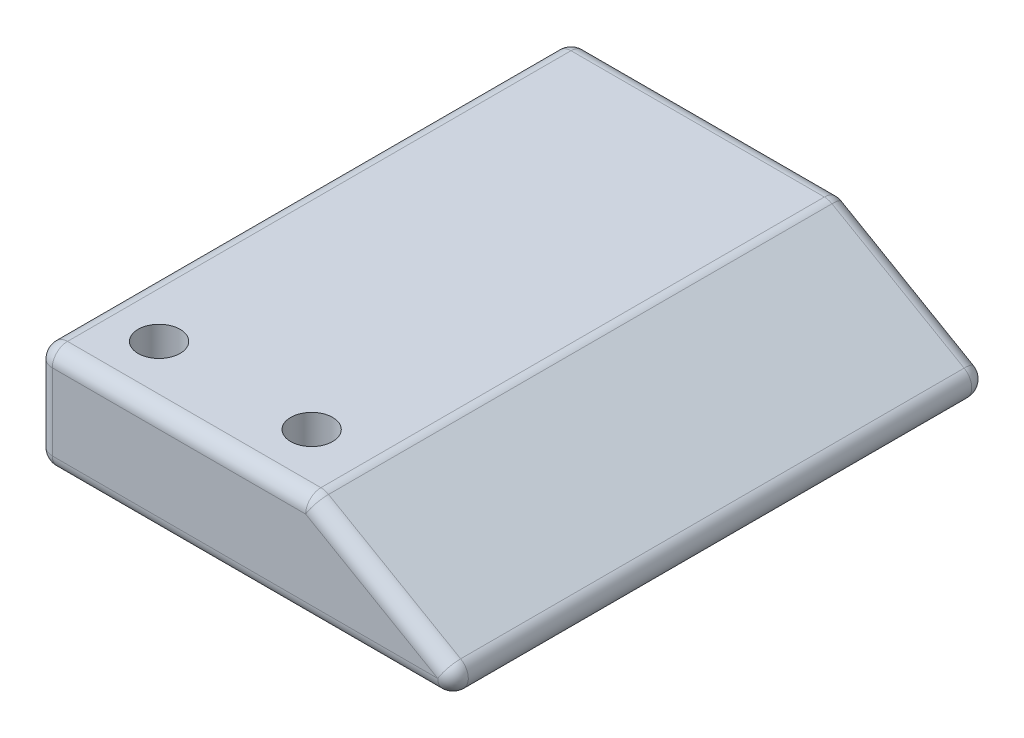
ISO-10303-21;
HEADER;
FILE_DESCRIPTION(('STEP AP214'),'2;1');
FILE_NAME('part.step','',(''),(''),'','','');
FILE_SCHEMA(('AUTOMOTIVE_DESIGN { 1 0 10303 214 1 1 1 1 }'));
ENDSEC;
DATA;
#1=APPLICATION_CONTEXT('core data for automotive mechanical design processes');
#2=APPLICATION_PROTOCOL_DEFINITION('international standard','automotive_design',2000,#1);
#3=PRODUCT_CONTEXT('',#1,'mechanical');
#4=PRODUCT('Part','Part','',(#3));
#5=PRODUCT_RELATED_PRODUCT_CATEGORY('part','',(#4));
#6=PRODUCT_DEFINITION_FORMATION('','',#4);
#7=PRODUCT_DEFINITION_CONTEXT('part definition',#1,'design');
#8=PRODUCT_DEFINITION('design','',#6,#7);
#9=PRODUCT_DEFINITION_SHAPE('','',#8);
#10=(LENGTH_UNIT() NAMED_UNIT(*) SI_UNIT(.MILLI.,.METRE.));
#11=(NAMED_UNIT(*) PLANE_ANGLE_UNIT() SI_UNIT($,.RADIAN.));
#12=(NAMED_UNIT(*) SI_UNIT($,.STERADIAN.) SOLID_ANGLE_UNIT());
#13=UNCERTAINTY_MEASURE_WITH_UNIT(LENGTH_MEASURE(1.E-05),#10,'distance_accuracy_value','');
#14=(GEOMETRIC_REPRESENTATION_CONTEXT(3) GLOBAL_UNCERTAINTY_ASSIGNED_CONTEXT((#13)) GLOBAL_UNIT_ASSIGNED_CONTEXT((#10,
#11,#12)) REPRESENTATION_CONTEXT('',''));
#15=CARTESIAN_POINT('',(0.,0.,0.));
#16=DIRECTION('',(0.,0.,1.));
#17=DIRECTION('',(1.,0.,0.));
#18=AXIS2_PLACEMENT_3D('',#15,#16,#17);
#19=CARTESIAN_POINT('',(60.,0.,-70.));
#20=DIRECTION('',(0.,1.,0.));
#21=DIRECTION('',(0.,0.,-1.));
#22=AXIS2_PLACEMENT_3D('',#19,#20,#21);
#23=PLANE('',#22);
#24=DIRECTION('',(1.,0.,0.));
#25=VECTOR('',#24,1.);
#26=CARTESIAN_POINT('',(60.,0.,-2.));
#27=LINE('',#26,#25);
#28=CARTESIAN_POINT('',(2.,0.,-2.));
#29=VERTEX_POINT('',#28);
#30=CARTESIAN_POINT('',(52.5358983848623,0.,-2.));
#31=VERTEX_POINT('',#30);
#32=EDGE_CURVE('E181',#29,#31,#27,.T.);
#33=ORIENTED_EDGE('',*,*,#32,.F.);
#34=DIRECTION('',(0.,0.,1.));
#35=VECTOR('',#34,1.);
#36=CARTESIAN_POINT('',(2.,0.,-70.));
#37=LINE('',#36,#35);
#38=CARTESIAN_POINT('',(2.,0.,-68.));
#39=VERTEX_POINT('',#38);
#40=EDGE_CURVE('E175',#39,#29,#37,.T.);
#41=ORIENTED_EDGE('',*,*,#40,.F.);
#42=DIRECTION('',(1.,0.,0.));
#43=VECTOR('',#42,1.);
#44=CARTESIAN_POINT('',(60.,0.,-68.));
#45=LINE('',#44,#43);
#46=CARTESIAN_POINT('',(52.5358983848623,0.,-68.));
#47=VERTEX_POINT('',#46);
#48=EDGE_CURVE('E178',#47,#39,#45,.F.);
#49=ORIENTED_EDGE('',*,*,#48,.F.);
#50=DIRECTION('',(0.,0.,1.));
#51=VECTOR('',#50,1.);
#52=CARTESIAN_POINT('',(52.5358983848623,0.,-70.));
#53=LINE('',#52,#51);
#54=EDGE_CURVE('E184',#31,#47,#53,.F.);
#55=ORIENTED_EDGE('',*,*,#54,.F.);
#56=EDGE_LOOP('',(#33,#41,#49,#55));
#57=FACE_BOUND('',#56,.T.);
#58=CARTESIAN_POINT('',(8.,0.,-8.));
#59=DIRECTION('',(0.,1.,0.));
#60=DIRECTION('',(0.,0.,1.));
#61=AXIS2_PLACEMENT_3D('',#58,#59,#60);
#62=CIRCLE('',#61,5.6);
#63=CARTESIAN_POINT('',(8.,0.,-2.4));
#64=VERTEX_POINT('',#63);
#65=EDGE_CURVE('E269',#64,#64,#62,.T.);
#66=ORIENTED_EDGE('',*,*,#65,.T.);
#67=EDGE_LOOP('',(#66));
#68=FACE_BOUND('',#67,.T.);
#69=CARTESIAN_POINT('',(28.,0.,-8.));
#70=DIRECTION('',(0.,1.,0.));
#71=DIRECTION('',(0.,0.,1.));
#72=AXIS2_PLACEMENT_3D('',#69,#70,#71);
#73=CIRCLE('',#72,5.6);
#74=CARTESIAN_POINT('',(28.,0.,-2.4));
#75=VERTEX_POINT('',#74);
#76=EDGE_CURVE('E282',#75,#75,#73,.T.);
#77=ORIENTED_EDGE('',*,*,#76,.T.);
#78=EDGE_LOOP('',(#77));
#79=FACE_BOUND('',#78,.T.);
#80=ADVANCED_FACE('F37',(#57,#68,#79),#23,.F.);
#81=CARTESIAN_POINT('',(35.7512886940358,14.,-70.));
#82=DIRECTION('',(-0.500000000000001,-0.866025403784438,0.));
#83=DIRECTION('',(0.866025403784438,-0.500000000000001,0.));
#84=AXIS2_PLACEMENT_3D('',#81,#82,#83);
#85=PLANE('',#84);
#86=DIRECTION('',(0.,0.,1.));
#87=VECTOR('',#86,1.);
#88=CARTESIAN_POINT('',(53.5358983848623,3.73205080756888,-70.));
#89=LINE('',#88,#87);
#90=CARTESIAN_POINT('',(53.5358983848623,3.73205080756887,-68.));
#91=VERTEX_POINT('',#90);
#92=CARTESIAN_POINT('',(53.5358983848623,3.73205080756887,-2.));
#93=VERTEX_POINT('',#92);
#94=EDGE_CURVE('E161',#91,#93,#89,.T.);
#95=ORIENTED_EDGE('',*,*,#94,.F.);
#96=DIRECTION('',(-0.866025403784438,0.500000000000001,0.));
#97=VECTOR('',#96,1.);
#98=CARTESIAN_POINT('',(35.7512886940358,14.,-68.));
#99=LINE('',#98,#97);
#100=CARTESIAN_POINT('',(36.2153903091736,13.7320508075689,-68.));
#101=VERTEX_POINT('',#100);
#102=EDGE_CURVE('E134',#101,#91,#99,.F.);
#103=ORIENTED_EDGE('',*,*,#102,.F.);
#104=DIRECTION('',(0.,0.,1.));
#105=VECTOR('',#104,1.);
#106=CARTESIAN_POINT('',(36.2153903091736,13.7320508075689,-70.));
#107=LINE('',#106,#105);
#108=CARTESIAN_POINT('',(36.2153903091736,13.7320508075689,-2.));
#109=VERTEX_POINT('',#108);
#110=EDGE_CURVE('E155',#109,#101,#107,.F.);
#111=ORIENTED_EDGE('',*,*,#110,.F.);
#112=DIRECTION('',(-0.866025403784438,0.500000000000001,0.));
#113=VECTOR('',#112,1.);
#114=CARTESIAN_POINT('',(35.7512886940358,14.,-2.));
#115=LINE('',#114,#113);
#116=EDGE_CURVE('E173',#93,#109,#115,.T.);
#117=ORIENTED_EDGE('',*,*,#116,.F.);
#118=EDGE_LOOP('',(#95,#103,#111,#117));
#119=FACE_BOUND('',#118,.T.);
#120=ADVANCED_FACE('F163',(#119),#85,.F.);
#121=CARTESIAN_POINT('',(0.,14.,-70.));
#122=DIRECTION('',(0.,-1.,0.));
#123=DIRECTION('',(0.,0.,1.));
#124=AXIS2_PLACEMENT_3D('',#121,#122,#123);
#125=PLANE('',#124);
#126=DIRECTION('',(-1.,0.,0.));
#127=VECTOR('',#126,1.);
#128=CARTESIAN_POINT('',(0.,14.,-68.));
#129=LINE('',#128,#127);
#130=CARTESIAN_POINT('',(2.,14.,-68.));
#131=VERTEX_POINT('',#130);
#132=CARTESIAN_POINT('',(35.2153903091736,14.,-68.));
#133=VERTEX_POINT('',#132);
#134=EDGE_CURVE('E190',#131,#133,#129,.F.);
#135=ORIENTED_EDGE('',*,*,#134,.F.);
#136=DIRECTION('',(0.,0.,1.));
#137=VECTOR('',#136,1.);
#138=CARTESIAN_POINT('',(2.,14.,-70.));
#139=LINE('',#138,#137);
#140=CARTESIAN_POINT('',(2.,14.,-2.));
#141=VERTEX_POINT('',#140);
#142=EDGE_CURVE('E187',#141,#131,#139,.F.);
#143=ORIENTED_EDGE('',*,*,#142,.F.);
#144=DIRECTION('',(-1.,0.,0.));
#145=VECTOR('',#144,1.);
#146=CARTESIAN_POINT('',(0.,14.,-2.));
#147=LINE('',#146,#145);
#148=CARTESIAN_POINT('',(35.2153903091736,14.,-2.));
#149=VERTEX_POINT('',#148);
#150=EDGE_CURVE('E193',#149,#141,#147,.T.);
#151=ORIENTED_EDGE('',*,*,#150,.F.);
#152=DIRECTION('',(0.,0.,1.));
#153=VECTOR('',#152,1.);
#154=CARTESIAN_POINT('',(35.2153903091736,14.,-70.));
#155=LINE('',#154,#153);
#156=EDGE_CURVE('E196',#133,#149,#155,.T.);
#157=ORIENTED_EDGE('',*,*,#156,.F.);
#158=EDGE_LOOP('',(#135,#143,#151,#157));
#159=FACE_BOUND('',#158,.T.);
#160=CARTESIAN_POINT('',(8.,14.,-8.));
#161=DIRECTION('',(0.,1.,0.));
#162=DIRECTION('',(0.,0.,1.));
#163=AXIS2_PLACEMENT_3D('',#160,#161,#162);
#164=CIRCLE('',#163,2.75);
#165=CARTESIAN_POINT('',(8.,14.,-5.25));
#166=VERTEX_POINT('',#165);
#167=EDGE_CURVE('E277',#166,#166,#164,.T.);
#168=ORIENTED_EDGE('',*,*,#167,.F.);
#169=EDGE_LOOP('',(#168));
#170=FACE_BOUND('',#169,.T.);
#171=CARTESIAN_POINT('',(28.,14.,-8.));
#172=DIRECTION('',(0.,1.,0.));
#173=DIRECTION('',(0.,0.,1.));
#174=AXIS2_PLACEMENT_3D('',#171,#172,#173);
#175=CIRCLE('',#174,2.75);
#176=CARTESIAN_POINT('',(28.,14.,-5.25));
#177=VERTEX_POINT('',#176);
#178=EDGE_CURVE('E165',#177,#177,#175,.T.);
#179=ORIENTED_EDGE('',*,*,#178,.F.);
#180=EDGE_LOOP('',(#179));
#181=FACE_BOUND('',#180,.T.);
#182=ADVANCED_FACE('F311',(#159,#170,#181),#125,.F.);
#183=CARTESIAN_POINT('',(0.,0.,-70.));
#184=DIRECTION('',(1.,0.,0.));
#185=DIRECTION('',(0.,0.,1.));
#186=AXIS2_PLACEMENT_3D('',#183,#184,#185);
#187=PLANE('',#186);
#188=DIRECTION('',(0.,-1.,0.));
#189=VECTOR('',#188,1.);
#190=CARTESIAN_POINT('',(0.,0.,-68.));
#191=LINE('',#190,#189);
#192=CARTESIAN_POINT('',(0.,2.,-68.));
#193=VERTEX_POINT('',#192);
#194=CARTESIAN_POINT('',(0.,12.,-68.));
#195=VERTEX_POINT('',#194);
#196=EDGE_CURVE('E46',#193,#195,#191,.F.);
#197=ORIENTED_EDGE('',*,*,#196,.F.);
#198=DIRECTION('',(0.,0.,1.));
#199=VECTOR('',#198,1.);
#200=CARTESIAN_POINT('',(0.,2.,-70.));
#201=LINE('',#200,#199);
#202=CARTESIAN_POINT('',(0.,2.,-2.));
#203=VERTEX_POINT('',#202);
#204=EDGE_CURVE('E223',#203,#193,#201,.F.);
#205=ORIENTED_EDGE('',*,*,#204,.F.);
#206=DIRECTION('',(0.,-1.,0.));
#207=VECTOR('',#206,1.);
#208=CARTESIAN_POINT('',(0.,0.,-2.));
#209=LINE('',#208,#207);
#210=CARTESIAN_POINT('',(0.,12.,-2.));
#211=VERTEX_POINT('',#210);
#212=EDGE_CURVE('E220',#211,#203,#209,.T.);
#213=ORIENTED_EDGE('',*,*,#212,.F.);
#214=DIRECTION('',(0.,0.,1.));
#215=VECTOR('',#214,1.);
#216=CARTESIAN_POINT('',(0.,12.,-70.));
#217=LINE('',#216,#215);
#218=EDGE_CURVE('E11',#195,#211,#217,.T.);
#219=ORIENTED_EDGE('',*,*,#218,.F.);
#220=EDGE_LOOP('',(#197,#205,#213,#219));
#221=FACE_BOUND('',#220,.T.);
#222=ADVANCED_FACE('F393',(#221),#187,.F.);
#223=CARTESIAN_POINT('',(0.,0.,-70.));
#224=DIRECTION('',(0.,0.,1.));
#225=DIRECTION('',(-1.,0.,0.));
#226=AXIS2_PLACEMENT_3D('',#223,#224,#225);
#227=PLANE('',#226);
#228=DIRECTION('',(-0.866025403784438,0.500000000000001,0.));
#229=VECTOR('',#228,1.);
#230=CARTESIAN_POINT('',(14.0000000000001,24.2487113059643,-70.));
#231=LINE('',#230,#229);
#232=CARTESIAN_POINT('',(52.5358983848623,2.,-70.));
#233=VERTEX_POINT('',#232);
#234=CARTESIAN_POINT('',(35.2153903091736,12.,-70.));
#235=VERTEX_POINT('',#234);
#236=EDGE_CURVE('E137',#233,#235,#231,.T.);
#237=ORIENTED_EDGE('',*,*,#236,.F.);
#238=DIRECTION('',(1.,0.,0.));
#239=VECTOR('',#238,1.);
#240=CARTESIAN_POINT('',(0.,2.,-70.));
#241=LINE('',#240,#239);
#242=CARTESIAN_POINT('',(2.,2.,-70.));
#243=VERTEX_POINT('',#242);
#244=EDGE_CURVE('E213',#243,#233,#241,.T.);
#245=ORIENTED_EDGE('',*,*,#244,.F.);
#246=DIRECTION('',(0.,-1.,0.));
#247=VECTOR('',#246,1.);
#248=CARTESIAN_POINT('',(2.,0.,-70.));
#249=LINE('',#248,#247);
#250=CARTESIAN_POINT('',(2.,12.,-70.));
#251=VERTEX_POINT('',#250);
#252=EDGE_CURVE('E210',#251,#243,#249,.T.);
#253=ORIENTED_EDGE('',*,*,#252,.F.);
#254=DIRECTION('',(-1.,0.,0.));
#255=VECTOR('',#254,1.);
#256=CARTESIAN_POINT('',(0.,12.,-70.));
#257=LINE('',#256,#255);
#258=EDGE_CURVE('E217',#235,#251,#257,.T.);
#259=ORIENTED_EDGE('',*,*,#258,.F.);
#260=EDGE_LOOP('',(#237,#245,#253,#259));
#261=FACE_BOUND('',#260,.T.);
#262=ADVANCED_FACE('F301',(#261),#227,.F.);
#263=CARTESIAN_POINT('',(0.,0.,0.));
#264=DIRECTION('',(0.,0.,1.));
#265=DIRECTION('',(-1.,0.,0.));
#266=AXIS2_PLACEMENT_3D('',#263,#264,#265);
#267=PLANE('',#266);
#268=DIRECTION('',(-1.,0.,0.));
#269=VECTOR('',#268,1.);
#270=CARTESIAN_POINT('',(35.7512886940358,12.,0.));
#271=LINE('',#270,#269);
#272=CARTESIAN_POINT('',(2.,12.,0.));
#273=VERTEX_POINT('',#272);
#274=CARTESIAN_POINT('',(35.2153903091736,12.,0.));
#275=VERTEX_POINT('',#274);
#276=EDGE_CURVE('E204',#273,#275,#271,.F.);
#277=ORIENTED_EDGE('',*,*,#276,.F.);
#278=DIRECTION('',(0.,-1.,0.));
#279=VECTOR('',#278,1.);
#280=CARTESIAN_POINT('',(2.,14.,0.));
#281=LINE('',#280,#279);
#282=CARTESIAN_POINT('',(2.,2.,0.));
#283=VERTEX_POINT('',#282);
#284=EDGE_CURVE('E198',#283,#273,#281,.F.);
#285=ORIENTED_EDGE('',*,*,#284,.F.);
#286=DIRECTION('',(1.,0.,0.));
#287=VECTOR('',#286,1.);
#288=CARTESIAN_POINT('',(0.,2.,0.));
#289=LINE('',#288,#287);
#290=CARTESIAN_POINT('',(52.5358983848623,2.,0.));
#291=VERTEX_POINT('',#290);
#292=EDGE_CURVE('E201',#291,#283,#289,.F.);
#293=ORIENTED_EDGE('',*,*,#292,.F.);
#294=DIRECTION('',(-0.866025403784438,0.500000000000001,0.));
#295=VECTOR('',#294,1.);
#296=CARTESIAN_POINT('',(59.,-1.73205080756888,0.));
#297=LINE('',#296,#295);
#298=EDGE_CURVE('E207',#275,#291,#297,.F.);
#299=ORIENTED_EDGE('',*,*,#298,.F.);
#300=EDGE_LOOP('',(#277,#285,#293,#299));
#301=FACE_BOUND('',#300,.T.);
#302=ADVANCED_FACE('F292',(#301),#267,.T.);
#303=CARTESIAN_POINT('',(28.,0.,-8.));
#304=DIRECTION('',(0.,-1.,0.));
#305=DIRECTION('',(0.,0.,1.));
#306=AXIS2_PLACEMENT_3D('',#303,#304,#305);
#307=CYLINDRICAL_SURFACE('',#306,2.75);
#308=ORIENTED_EDGE('',*,*,#178,.T.);
#309=EDGE_LOOP('',(#308));
#310=FACE_BOUND('',#309,.T.);
#311=CARTESIAN_POINT('',(28.,2.85,-8.));
#312=DIRECTION('',(0.,1.,0.));
#313=DIRECTION('',(0.,0.,1.));
#314=AXIS2_PLACEMENT_3D('',#311,#312,#313);
#315=CIRCLE('',#314,2.75);
#316=CARTESIAN_POINT('',(28.,2.85,-5.25));
#317=VERTEX_POINT('',#316);
#318=EDGE_CURVE('E168',#317,#317,#315,.T.);
#319=ORIENTED_EDGE('',*,*,#318,.F.);
#320=EDGE_LOOP('',(#319));
#321=FACE_BOUND('',#320,.T.);
#322=ADVANCED_FACE('F290',(#310,#321),#307,.F.);
#323=CARTESIAN_POINT('',(28.,0.,-8.));
#324=DIRECTION('',(0.,-1.,0.));
#325=DIRECTION('',(0.,0.,1.));
#326=AXIS2_PLACEMENT_3D('',#323,#324,#325);
#327=CONICAL_SURFACE('',#326,5.6,0.785398163397449);
#328=ORIENTED_EDGE('',*,*,#318,.T.);
#329=EDGE_LOOP('',(#328));
#330=FACE_BOUND('',#329,.T.);
#331=ORIENTED_EDGE('',*,*,#76,.F.);
#332=EDGE_LOOP('',(#331));
#333=FACE_BOUND('',#332,.T.);
#334=ADVANCED_FACE('F287',(#330,#333),#327,.F.);
#335=CARTESIAN_POINT('',(8.,0.,-8.));
#336=DIRECTION('',(0.,-1.,0.));
#337=DIRECTION('',(0.,0.,1.));
#338=AXIS2_PLACEMENT_3D('',#335,#336,#337);
#339=CYLINDRICAL_SURFACE('',#338,2.75);
#340=ORIENTED_EDGE('',*,*,#167,.T.);
#341=EDGE_LOOP('',(#340));
#342=FACE_BOUND('',#341,.T.);
#343=CARTESIAN_POINT('',(8.,2.85,-8.));
#344=DIRECTION('',(0.,1.,0.));
#345=DIRECTION('',(0.,0.,1.));
#346=AXIS2_PLACEMENT_3D('',#343,#344,#345);
#347=CIRCLE('',#346,2.75);
#348=CARTESIAN_POINT('',(8.,2.85,-5.25));
#349=VERTEX_POINT('',#348);
#350=EDGE_CURVE('E272',#349,#349,#347,.T.);
#351=ORIENTED_EDGE('',*,*,#350,.F.);
#352=EDGE_LOOP('',(#351));
#353=FACE_BOUND('',#352,.T.);
#354=ADVANCED_FACE('F299',(#342,#353),#339,.F.);
#355=CARTESIAN_POINT('',(8.,0.,-8.));
#356=DIRECTION('',(0.,-1.,0.));
#357=DIRECTION('',(0.,0.,1.));
#358=AXIS2_PLACEMENT_3D('',#355,#356,#357);
#359=CONICAL_SURFACE('',#358,5.6,0.785398163397448);
#360=ORIENTED_EDGE('',*,*,#350,.T.);
#361=EDGE_LOOP('',(#360));
#362=FACE_BOUND('',#361,.T.);
#363=ORIENTED_EDGE('',*,*,#65,.F.);
#364=EDGE_LOOP('',(#363));
#365=FACE_BOUND('',#364,.T.);
#366=ADVANCED_FACE('F385',(#362,#365),#359,.F.);
#367=CARTESIAN_POINT('',(2.,12.,-70.));
#368=DIRECTION('',(0.,0.,1.));
#369=DIRECTION('',(-1.,0.,0.));
#370=AXIS2_PLACEMENT_3D('',#367,#368,#369);
#371=CYLINDRICAL_SURFACE('',#370,2.);
#372=CARTESIAN_POINT('',(2.,12.,-68.));
#373=DIRECTION('',(0.,0.,1.));
#374=DIRECTION('',(1.,0.,0.));
#375=AXIS2_PLACEMENT_3D('',#372,#373,#374);
#376=CIRCLE('',#375,2.);
#377=EDGE_CURVE('E41',#131,#195,#376,.T.);
#378=ORIENTED_EDGE('',*,*,#377,.T.);
#379=ORIENTED_EDGE('',*,*,#218,.T.);
#380=CARTESIAN_POINT('',(2.,12.,-2.));
#381=DIRECTION('',(0.,0.,-1.));
#382=DIRECTION('',(-1.,0.,0.));
#383=AXIS2_PLACEMENT_3D('',#380,#381,#382);
#384=CIRCLE('',#383,2.);
#385=EDGE_CURVE('E265',#211,#141,#384,.T.);
#386=ORIENTED_EDGE('',*,*,#385,.T.);
#387=ORIENTED_EDGE('',*,*,#142,.T.);
#388=EDGE_LOOP('',(#378,#379,#386,#387));
#389=FACE_BOUND('',#388,.T.);
#390=ADVANCED_FACE('F39',(#389),#371,.T.);
#391=CARTESIAN_POINT('',(2.,12.,-68.));
#392=DIRECTION('',(0.,0.,-1.));
#393=DIRECTION('',(1.,0.,0.));
#394=AXIS2_PLACEMENT_3D('',#391,#392,#393);
#395=SPHERICAL_SURFACE('',#394,2.);
#396=CARTESIAN_POINT('',(2.,12.,-68.));
#397=DIRECTION('',(1.,0.,0.));
#398=DIRECTION('',(0.,0.,-1.));
#399=AXIS2_PLACEMENT_3D('',#396,#397,#398);
#400=CIRCLE('',#399,2.);
#401=EDGE_CURVE('E263',#131,#251,#400,.F.);
#402=ORIENTED_EDGE('',*,*,#401,.T.);
#403=CARTESIAN_POINT('',(2.,12.,-68.));
#404=DIRECTION('',(0.,-1.,0.));
#405=DIRECTION('',(0.,0.,-1.));
#406=AXIS2_PLACEMENT_3D('',#403,#404,#405);
#407=CIRCLE('',#406,2.);
#408=EDGE_CURVE('E54',#251,#195,#407,.F.);
#409=ORIENTED_EDGE('',*,*,#408,.T.);
#410=ORIENTED_EDGE('',*,*,#377,.F.);
#411=EDGE_LOOP('',(#402,#409,#410));
#412=FACE_BOUND('',#411,.T.);
#413=ADVANCED_FACE('F379',(#412),#395,.T.);
#414=CARTESIAN_POINT('',(2.,12.,-2.));
#415=DIRECTION('',(0.,0.,-1.));
#416=DIRECTION('',(1.,0.,0.));
#417=AXIS2_PLACEMENT_3D('',#414,#415,#416);
#418=SPHERICAL_SURFACE('',#417,2.);
#419=CARTESIAN_POINT('',(2.,12.,-2.));
#420=DIRECTION('',(0.,-1.,0.));
#421=DIRECTION('',(0.,0.,-1.));
#422=AXIS2_PLACEMENT_3D('',#419,#420,#421);
#423=CIRCLE('',#422,2.);
#424=EDGE_CURVE('E258',#211,#273,#423,.F.);
#425=ORIENTED_EDGE('',*,*,#424,.T.);
#426=CARTESIAN_POINT('',(2.,12.,-2.));
#427=DIRECTION('',(1.,0.,0.));
#428=DIRECTION('',(0.,0.,-1.));
#429=AXIS2_PLACEMENT_3D('',#426,#427,#428);
#430=CIRCLE('',#429,2.);
#431=EDGE_CURVE('E261',#273,#141,#430,.F.);
#432=ORIENTED_EDGE('',*,*,#431,.T.);
#433=ORIENTED_EDGE('',*,*,#385,.F.);
#434=EDGE_LOOP('',(#425,#432,#433));
#435=FACE_BOUND('',#434,.T.);
#436=ADVANCED_FACE('F376',(#435),#418,.T.);
#437=CARTESIAN_POINT('',(2.,0.,-68.));
#438=DIRECTION('',(0.,-1.,0.));
#439=DIRECTION('',(0.,0.,1.));
#440=AXIS2_PLACEMENT_3D('',#437,#438,#439);
#441=CYLINDRICAL_SURFACE('',#440,2.);
#442=ORIENTED_EDGE('',*,*,#408,.F.);
#443=ORIENTED_EDGE('',*,*,#252,.T.);
#444=CARTESIAN_POINT('',(2.,2.,-68.));
#445=DIRECTION('',(0.,1.,0.));
#446=DIRECTION('',(0.,0.,1.));
#447=AXIS2_PLACEMENT_3D('',#444,#445,#446);
#448=CIRCLE('',#447,2.);
#449=EDGE_CURVE('E255',#243,#193,#448,.T.);
#450=ORIENTED_EDGE('',*,*,#449,.T.);
#451=ORIENTED_EDGE('',*,*,#196,.T.);
#452=EDGE_LOOP('',(#442,#443,#450,#451));
#453=FACE_BOUND('',#452,.T.);
#454=ADVANCED_FACE('F372',(#453),#441,.T.);
#455=CARTESIAN_POINT('',(0.,12.,-68.));
#456=DIRECTION('',(-1.,0.,0.));
#457=DIRECTION('',(0.,0.,-1.));
#458=AXIS2_PLACEMENT_3D('',#455,#456,#457);
#459=CYLINDRICAL_SURFACE('',#458,2.);
#460=ORIENTED_EDGE('',*,*,#401,.F.);
#461=ORIENTED_EDGE('',*,*,#134,.T.);
#462=CARTESIAN_POINT('',(35.2153903091736,12.,-68.));
#463=DIRECTION('',(-1.,0.,0.));
#464=DIRECTION('',(0.,0.,1.));
#465=AXIS2_PLACEMENT_3D('',#462,#463,#464);
#466=CIRCLE('',#465,2.);
#467=EDGE_CURVE('E147',#133,#235,#466,.T.);
#468=ORIENTED_EDGE('',*,*,#467,.T.);
#469=ORIENTED_EDGE('',*,*,#258,.T.);
#470=EDGE_LOOP('',(#460,#461,#468,#469));
#471=FACE_BOUND('',#470,.T.);
#472=ADVANCED_FACE('F369',(#471),#459,.T.);
#473=CARTESIAN_POINT('',(35.2153903091736,12.,-70.));
#474=DIRECTION('',(0.,0.,1.));
#475=DIRECTION('',(-1.,0.,0.));
#476=AXIS2_PLACEMENT_3D('',#473,#474,#475);
#477=CYLINDRICAL_SURFACE('',#476,2.);
#478=CARTESIAN_POINT('',(35.2153903091736,12.,-2.));
#479=DIRECTION('',(0.,0.,-1.));
#480=DIRECTION('',(-1.,0.,0.));
#481=AXIS2_PLACEMENT_3D('',#478,#479,#480);
#482=CIRCLE('',#481,2.);
#483=EDGE_CURVE('E151',#149,#109,#482,.T.);
#484=ORIENTED_EDGE('',*,*,#483,.T.);
#485=ORIENTED_EDGE('',*,*,#110,.T.);
#486=CARTESIAN_POINT('',(35.2153903091736,12.,-68.));
#487=DIRECTION('',(0.,0.,1.));
#488=DIRECTION('',(1.,0.,0.));
#489=AXIS2_PLACEMENT_3D('',#486,#487,#488);
#490=CIRCLE('',#489,2.);
#491=EDGE_CURVE('E144',#101,#133,#490,.T.);
#492=ORIENTED_EDGE('',*,*,#491,.T.);
#493=ORIENTED_EDGE('',*,*,#156,.T.);
#494=EDGE_LOOP('',(#484,#485,#492,#493));
#495=FACE_BOUND('',#494,.T.);
#496=ADVANCED_FACE('F156',(#495),#477,.T.);
#497=CARTESIAN_POINT('',(0.,12.,-2.));
#498=DIRECTION('',(1.,0.,0.));
#499=DIRECTION('',(0.,0.,1.));
#500=AXIS2_PLACEMENT_3D('',#497,#498,#499);
#501=CYLINDRICAL_SURFACE('',#500,2.);
#502=ORIENTED_EDGE('',*,*,#431,.F.);
#503=ORIENTED_EDGE('',*,*,#276,.T.);
#504=CARTESIAN_POINT('',(35.2153903091736,12.,-2.));
#505=DIRECTION('',(-1.,0.,0.));
#506=DIRECTION('',(0.,0.,1.));
#507=AXIS2_PLACEMENT_3D('',#504,#505,#506);
#508=CIRCLE('',#507,2.);
#509=EDGE_CURVE('E251',#275,#149,#508,.T.);
#510=ORIENTED_EDGE('',*,*,#509,.T.);
#511=ORIENTED_EDGE('',*,*,#150,.T.);
#512=EDGE_LOOP('',(#502,#503,#510,#511));
#513=FACE_BOUND('',#512,.T.);
#514=ADVANCED_FACE('F362',(#513),#501,.T.);
#515=CARTESIAN_POINT('',(2.,0.,-2.));
#516=DIRECTION('',(0.,1.,0.));
#517=DIRECTION('',(0.,0.,-1.));
#518=AXIS2_PLACEMENT_3D('',#515,#516,#517);
#519=CYLINDRICAL_SURFACE('',#518,2.);
#520=ORIENTED_EDGE('',*,*,#424,.F.);
#521=ORIENTED_EDGE('',*,*,#212,.T.);
#522=CARTESIAN_POINT('',(2.,2.,-2.));
#523=DIRECTION('',(0.,1.,0.));
#524=DIRECTION('',(0.,0.,1.));
#525=AXIS2_PLACEMENT_3D('',#522,#523,#524);
#526=CIRCLE('',#525,2.);
#527=EDGE_CURVE('E248',#203,#283,#526,.T.);
#528=ORIENTED_EDGE('',*,*,#527,.T.);
#529=ORIENTED_EDGE('',*,*,#284,.T.);
#530=EDGE_LOOP('',(#520,#521,#528,#529));
#531=FACE_BOUND('',#530,.T.);
#532=ADVANCED_FACE('F358',(#531),#519,.T.);
#533=CARTESIAN_POINT('',(2.,2.,-70.));
#534=DIRECTION('',(0.,0.,1.));
#535=DIRECTION('',(-1.,0.,0.));
#536=AXIS2_PLACEMENT_3D('',#533,#534,#535);
#537=CYLINDRICAL_SURFACE('',#536,2.);
#538=CARTESIAN_POINT('',(2.,2.,-68.));
#539=DIRECTION('',(0.,0.,1.));
#540=DIRECTION('',(1.,0.,0.));
#541=AXIS2_PLACEMENT_3D('',#538,#539,#540);
#542=CIRCLE('',#541,2.);
#543=EDGE_CURVE('E62',#193,#39,#542,.T.);
#544=ORIENTED_EDGE('',*,*,#543,.T.);
#545=ORIENTED_EDGE('',*,*,#40,.T.);
#546=CARTESIAN_POINT('',(2.,2.,-2.));
#547=DIRECTION('',(0.,0.,-1.));
#548=DIRECTION('',(-1.,0.,0.));
#549=AXIS2_PLACEMENT_3D('',#546,#547,#548);
#550=CIRCLE('',#549,2.);
#551=EDGE_CURVE('E246',#29,#203,#550,.T.);
#552=ORIENTED_EDGE('',*,*,#551,.T.);
#553=ORIENTED_EDGE('',*,*,#204,.T.);
#554=EDGE_LOOP('',(#544,#545,#552,#553));
#555=FACE_BOUND('',#554,.T.);
#556=ADVANCED_FACE('F355',(#555),#537,.T.);
#557=CARTESIAN_POINT('',(2.,2.,-68.));
#558=DIRECTION('',(0.,0.,-1.));
#559=DIRECTION('',(1.,0.,0.));
#560=AXIS2_PLACEMENT_3D('',#557,#558,#559);
#561=SPHERICAL_SURFACE('',#560,2.);
#562=ORIENTED_EDGE('',*,*,#449,.F.);
#563=CARTESIAN_POINT('',(2.,2.,-68.));
#564=DIRECTION('',(1.,0.,0.));
#565=DIRECTION('',(0.,0.,-1.));
#566=AXIS2_PLACEMENT_3D('',#563,#564,#565);
#567=CIRCLE('',#566,2.);
#568=EDGE_CURVE('E141',#243,#39,#567,.F.);
#569=ORIENTED_EDGE('',*,*,#568,.T.);
#570=ORIENTED_EDGE('',*,*,#543,.F.);
#571=EDGE_LOOP('',(#562,#569,#570));
#572=FACE_BOUND('',#571,.T.);
#573=ADVANCED_FACE('F352',(#572),#561,.T.);
#574=CARTESIAN_POINT('',(35.2153903091736,12.,-68.));
#575=DIRECTION('',(0.,0.,-1.));
#576=DIRECTION('',(1.,0.,0.));
#577=AXIS2_PLACEMENT_3D('',#574,#575,#576);
#578=SPHERICAL_SURFACE('',#577,2.);
#579=ORIENTED_EDGE('',*,*,#491,.F.);
#580=CARTESIAN_POINT('',(35.2153903091736,12.,-68.));
#581=DIRECTION('',(0.866025403784437,-0.500000000000003,0.));
#582=DIRECTION('',(-0.500000000000003,-0.866025403784437,0.));
#583=AXIS2_PLACEMENT_3D('',#580,#581,#582);
#584=CIRCLE('',#583,2.);
#585=EDGE_CURVE('E130',#101,#235,#584,.F.);
#586=ORIENTED_EDGE('',*,*,#585,.T.);
#587=ORIENTED_EDGE('',*,*,#467,.F.);
#588=EDGE_LOOP('',(#579,#586,#587));
#589=FACE_BOUND('',#588,.T.);
#590=ADVANCED_FACE('F146',(#589),#578,.T.);
#591=CARTESIAN_POINT('',(35.2153903091736,12.,-2.));
#592=DIRECTION('',(0.,0.,-1.));
#593=DIRECTION('',(1.,0.,0.));
#594=AXIS2_PLACEMENT_3D('',#591,#592,#593);
#595=SPHERICAL_SURFACE('',#594,2.);
#596=ORIENTED_EDGE('',*,*,#509,.F.);
#597=CARTESIAN_POINT('',(35.2153903091736,12.,-2.));
#598=DIRECTION('',(0.866025403784438,-0.500000000000001,0.));
#599=DIRECTION('',(-0.500000000000001,-0.866025403784438,0.));
#600=AXIS2_PLACEMENT_3D('',#597,#598,#599);
#601=CIRCLE('',#600,2.);
#602=EDGE_CURVE('E142',#275,#109,#601,.F.);
#603=ORIENTED_EDGE('',*,*,#602,.T.);
#604=ORIENTED_EDGE('',*,*,#483,.F.);
#605=EDGE_LOOP('',(#596,#603,#604));
#606=FACE_BOUND('',#605,.T.);
#607=ADVANCED_FACE('F345',(#606),#595,.T.);
#608=CARTESIAN_POINT('',(2.,2.,-2.));
#609=DIRECTION('',(0.,0.,-1.));
#610=DIRECTION('',(1.,0.,0.));
#611=AXIS2_PLACEMENT_3D('',#608,#609,#610);
#612=SPHERICAL_SURFACE('',#611,2.);
#613=ORIENTED_EDGE('',*,*,#551,.F.);
#614=CARTESIAN_POINT('',(2.,2.,-2.));
#615=DIRECTION('',(1.,0.,0.));
#616=DIRECTION('',(0.,-1.,0.));
#617=AXIS2_PLACEMENT_3D('',#614,#615,#616);
#618=CIRCLE('',#617,2.);
#619=EDGE_CURVE('E242',#29,#283,#618,.F.);
#620=ORIENTED_EDGE('',*,*,#619,.T.);
#621=ORIENTED_EDGE('',*,*,#527,.F.);
#622=EDGE_LOOP('',(#613,#620,#621));
#623=FACE_BOUND('',#622,.T.);
#624=ADVANCED_FACE('F341',(#623),#612,.T.);
#625=CARTESIAN_POINT('',(0.,2.,-68.));
#626=DIRECTION('',(1.,0.,0.));
#627=DIRECTION('',(0.,0.,1.));
#628=AXIS2_PLACEMENT_3D('',#625,#626,#627);
#629=CYLINDRICAL_SURFACE('',#628,2.);
#630=ORIENTED_EDGE('',*,*,#568,.F.);
#631=ORIENTED_EDGE('',*,*,#244,.T.);
#632=CARTESIAN_POINT('',(52.5358983848623,2.,-68.));
#633=DIRECTION('',(-1.,0.,0.));
#634=DIRECTION('',(0.,1.,0.));
#635=AXIS2_PLACEMENT_3D('',#632,#633,#634);
#636=CIRCLE('',#635,2.);
#637=EDGE_CURVE('E239',#233,#47,#636,.T.);
#638=ORIENTED_EDGE('',*,*,#637,.T.);
#639=ORIENTED_EDGE('',*,*,#48,.T.);
#640=EDGE_LOOP('',(#630,#631,#638,#639));
#641=FACE_BOUND('',#640,.T.);
#642=ADVANCED_FACE('F338',(#641),#629,.T.);
#643=CARTESIAN_POINT('',(14.0000000000001,24.2487113059643,-68.));
#644=DIRECTION('',(-0.866025403784438,0.500000000000001,0.));
#645=DIRECTION('',(-0.500000000000001,-0.866025403784438,0.));
#646=AXIS2_PLACEMENT_3D('',#643,#644,#645);
#647=CYLINDRICAL_SURFACE('',#646,2.);
#648=ORIENTED_EDGE('',*,*,#585,.F.);
#649=ORIENTED_EDGE('',*,*,#102,.T.);
#650=CARTESIAN_POINT('',(52.5358983848623,2.,-68.));
#651=DIRECTION('',(-0.866025403784438,0.500000000000001,0.));
#652=DIRECTION('',(0.500000000000001,0.866025403784438,0.));
#653=AXIS2_PLACEMENT_3D('',#650,#651,#652);
#654=CIRCLE('',#653,2.);
#655=EDGE_CURVE('E237',#91,#233,#654,.T.);
#656=ORIENTED_EDGE('',*,*,#655,.T.);
#657=ORIENTED_EDGE('',*,*,#236,.T.);
#658=EDGE_LOOP('',(#648,#649,#656,#657));
#659=FACE_BOUND('',#658,.T.);
#660=ADVANCED_FACE('F132',(#659),#647,.T.);
#661=CARTESIAN_POINT('',(34.7512886940358,12.2679491924311,-2.));
#662=DIRECTION('',(0.866025403784438,-0.500000000000001,0.));
#663=DIRECTION('',(0.500000000000001,0.866025403784438,0.));
#664=AXIS2_PLACEMENT_3D('',#661,#662,#663);
#665=CYLINDRICAL_SURFACE('',#664,2.);
#666=ORIENTED_EDGE('',*,*,#602,.F.);
#667=ORIENTED_EDGE('',*,*,#298,.T.);
#668=CARTESIAN_POINT('',(52.5358983848623,2.,-2.));
#669=DIRECTION('',(-0.866025403784436,0.500000000000003,0.));
#670=DIRECTION('',(0.500000000000004,0.866025403784437,0.));
#671=AXIS2_PLACEMENT_3D('',#668,#669,#670);
#672=CIRCLE('',#671,2.);
#673=EDGE_CURVE('E234',#291,#93,#672,.T.);
#674=ORIENTED_EDGE('',*,*,#673,.T.);
#675=ORIENTED_EDGE('',*,*,#116,.T.);
#676=EDGE_LOOP('',(#666,#667,#674,#675));
#677=FACE_BOUND('',#676,.T.);
#678=ADVANCED_FACE('F331',(#677),#665,.T.);
#679=CARTESIAN_POINT('',(60.,2.,-2.));
#680=DIRECTION('',(-1.,0.,0.));
#681=DIRECTION('',(0.,0.,-1.));
#682=AXIS2_PLACEMENT_3D('',#679,#680,#681);
#683=CYLINDRICAL_SURFACE('',#682,2.);
#684=ORIENTED_EDGE('',*,*,#619,.F.);
#685=ORIENTED_EDGE('',*,*,#32,.T.);
#686=CARTESIAN_POINT('',(52.5358983848623,2.,-2.));
#687=DIRECTION('',(-1.,0.,0.));
#688=DIRECTION('',(0.,0.,1.));
#689=AXIS2_PLACEMENT_3D('',#686,#687,#688);
#690=CIRCLE('',#689,2.);
#691=EDGE_CURVE('E232',#31,#291,#690,.T.);
#692=ORIENTED_EDGE('',*,*,#691,.T.);
#693=ORIENTED_EDGE('',*,*,#292,.T.);
#694=EDGE_LOOP('',(#684,#685,#692,#693));
#695=FACE_BOUND('',#694,.T.);
#696=ADVANCED_FACE('F327',(#695),#683,.T.);
#697=CARTESIAN_POINT('',(52.5358983848623,2.,-68.));
#698=DIRECTION('',(0.,0.,-1.));
#699=DIRECTION('',(1.,0.,0.));
#700=AXIS2_PLACEMENT_3D('',#697,#698,#699);
#701=SPHERICAL_SURFACE('',#700,2.);
#702=ORIENTED_EDGE('',*,*,#655,.F.);
#703=CARTESIAN_POINT('',(52.5358983848623,2.,-68.));
#704=DIRECTION('',(0.,0.,1.));
#705=DIRECTION('',(1.,0.,0.));
#706=AXIS2_PLACEMENT_3D('',#703,#704,#705);
#707=CIRCLE('',#706,2.);
#708=EDGE_CURVE('E230',#91,#47,#707,.F.);
#709=ORIENTED_EDGE('',*,*,#708,.T.);
#710=ORIENTED_EDGE('',*,*,#637,.F.);
#711=EDGE_LOOP('',(#702,#709,#710));
#712=FACE_BOUND('',#711,.T.);
#713=ADVANCED_FACE('F323',(#712),#701,.T.);
#714=CARTESIAN_POINT('',(52.5358983848623,2.,-2.));
#715=DIRECTION('',(0.,0.,-1.));
#716=DIRECTION('',(1.,0.,0.));
#717=AXIS2_PLACEMENT_3D('',#714,#715,#716);
#718=SPHERICAL_SURFACE('',#717,2.);
#719=ORIENTED_EDGE('',*,*,#691,.F.);
#720=CARTESIAN_POINT('',(52.5358983848623,2.,-2.));
#721=DIRECTION('',(0.,0.,-1.));
#722=DIRECTION('',(-1.,0.,0.));
#723=AXIS2_PLACEMENT_3D('',#720,#721,#722);
#724=CIRCLE('',#723,2.);
#725=EDGE_CURVE('E228',#31,#93,#724,.F.);
#726=ORIENTED_EDGE('',*,*,#725,.T.);
#727=ORIENTED_EDGE('',*,*,#673,.F.);
#728=EDGE_LOOP('',(#719,#726,#727));
#729=FACE_BOUND('',#728,.T.);
#730=ADVANCED_FACE('F319',(#729),#718,.T.);
#731=CARTESIAN_POINT('',(52.5358983848623,2.,-70.));
#732=DIRECTION('',(0.,0.,1.));
#733=DIRECTION('',(-1.,0.,0.));
#734=AXIS2_PLACEMENT_3D('',#731,#732,#733);
#735=CYLINDRICAL_SURFACE('',#734,2.);
#736=ORIENTED_EDGE('',*,*,#708,.F.);
#737=ORIENTED_EDGE('',*,*,#94,.T.);
#738=ORIENTED_EDGE('',*,*,#725,.F.);
#739=ORIENTED_EDGE('',*,*,#54,.T.);
#740=EDGE_LOOP('',(#736,#737,#738,#739));
#741=FACE_BOUND('',#740,.T.);
#742=ADVANCED_FACE('F316',(#741),#735,.T.);
#743=CLOSED_SHELL('',(#80,#120,#182,#222,#262,#302,#322,#334,#354,#366,#390,#413,#436,#454,#472,
#496,#514,#532,#556,#573,#590,#607,#624,#642,#660,#678,#696,#713,#730,#742));
#744=MANIFOLD_SOLID_BREP('B2',#743);
#745=ADVANCED_BREP_SHAPE_REPRESENTATION('',(#18,#744),#14);
#746=SHAPE_DEFINITION_REPRESENTATION(#9,#745);
ENDSEC;
END-ISO-10303-21;
